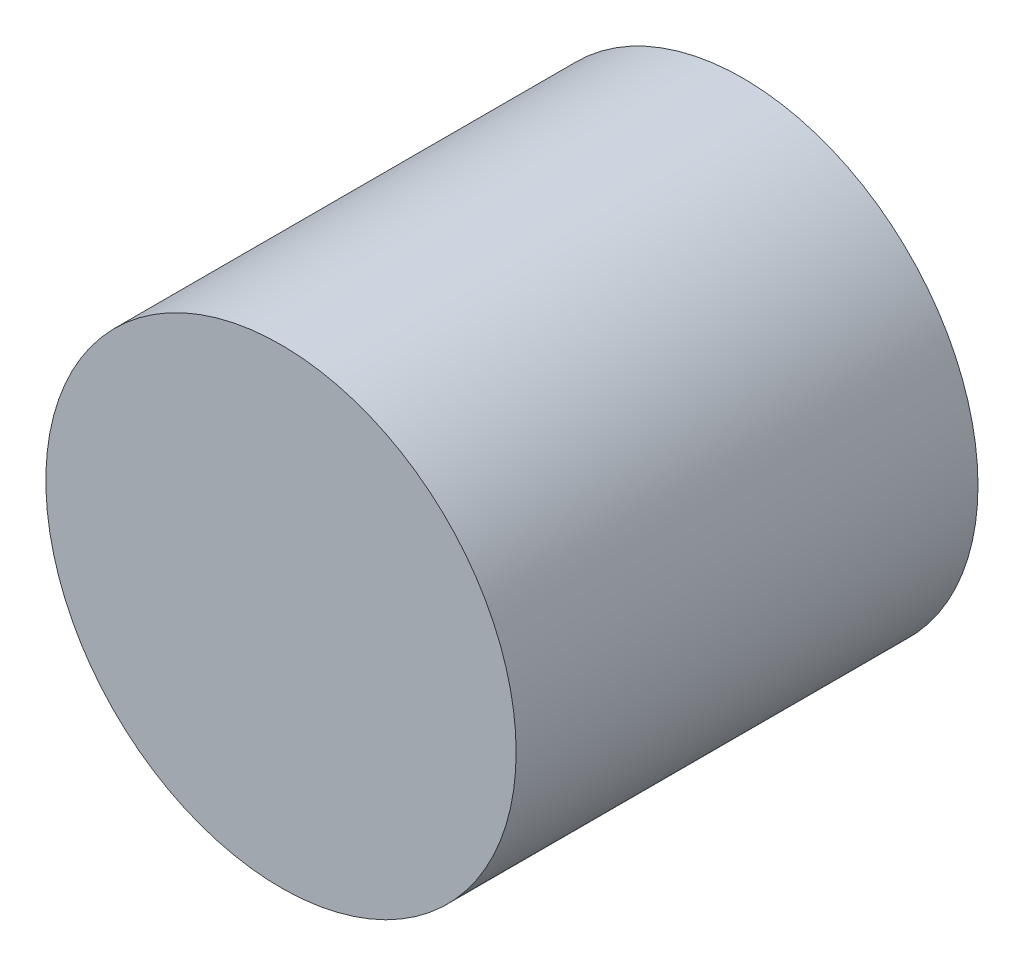
ISO-10303-21;
HEADER;
FILE_DESCRIPTION(('STEP AP214'),'2;1');
FILE_NAME('part.step','',(''),(''),'','','');
FILE_SCHEMA(('AUTOMOTIVE_DESIGN { 1 0 10303 214 1 1 1 1 }'));
ENDSEC;
DATA;
#1=APPLICATION_CONTEXT('core data for automotive mechanical design processes');
#2=APPLICATION_PROTOCOL_DEFINITION('international standard','automotive_design',2000,#1);
#3=PRODUCT_CONTEXT('',#1,'mechanical');
#4=PRODUCT('Part','Part','',(#3));
#5=PRODUCT_RELATED_PRODUCT_CATEGORY('part','',(#4));
#6=PRODUCT_DEFINITION_FORMATION('','',#4);
#7=PRODUCT_DEFINITION_CONTEXT('part definition',#1,'design');
#8=PRODUCT_DEFINITION('design','',#6,#7);
#9=PRODUCT_DEFINITION_SHAPE('','',#8);
#10=(LENGTH_UNIT() NAMED_UNIT(*) SI_UNIT(.MILLI.,.METRE.));
#11=(NAMED_UNIT(*) PLANE_ANGLE_UNIT() SI_UNIT($,.RADIAN.));
#12=(NAMED_UNIT(*) SI_UNIT($,.STERADIAN.) SOLID_ANGLE_UNIT());
#13=UNCERTAINTY_MEASURE_WITH_UNIT(LENGTH_MEASURE(1.E-05),#10,'distance_accuracy_value','');
#14=(GEOMETRIC_REPRESENTATION_CONTEXT(3) GLOBAL_UNCERTAINTY_ASSIGNED_CONTEXT((#13)) GLOBAL_UNIT_ASSIGNED_CONTEXT((#10,
#11,#12)) REPRESENTATION_CONTEXT('',''));
#15=CARTESIAN_POINT('',(0.,0.,0.));
#16=DIRECTION('',(0.,0.,1.));
#17=DIRECTION('',(1.,0.,0.));
#18=AXIS2_PLACEMENT_3D('',#15,#16,#17);
#19=CARTESIAN_POINT('',(0.,0.,-10.));
#20=DIRECTION('',(0.,0.,1.));
#21=DIRECTION('',(1.,0.,0.));
#22=AXIS2_PLACEMENT_3D('',#19,#20,#21);
#23=CYLINDRICAL_SURFACE('',#22,5.0915);
#24=CARTESIAN_POINT('',(0.,0.,-10.));
#25=DIRECTION('',(0.,0.,1.));
#26=DIRECTION('',(1.,0.,0.));
#27=AXIS2_PLACEMENT_3D('',#24,#25,#26);
#28=CIRCLE('',#27,5.0915);
#29=CARTESIAN_POINT('',(5.0915,0.,-10.));
#30=VERTEX_POINT('',#29);
#31=EDGE_CURVE('E10',#30,#30,#28,.T.);
#32=ORIENTED_EDGE('',*,*,#31,.T.);
#33=EDGE_LOOP('',(#32));
#34=FACE_BOUND('',#33,.T.);
#35=CARTESIAN_POINT('',(0.,0.,0.));
#36=DIRECTION('',(0.,0.,1.));
#37=DIRECTION('',(1.,0.,0.));
#38=AXIS2_PLACEMENT_3D('',#35,#36,#37);
#39=CIRCLE('',#38,5.0915);
#40=CARTESIAN_POINT('',(5.0915,0.,0.));
#41=VERTEX_POINT('',#40);
#42=EDGE_CURVE('E35',#41,#41,#39,.T.);
#43=ORIENTED_EDGE('',*,*,#42,.F.);
#44=EDGE_LOOP('',(#43));
#45=FACE_BOUND('',#44,.T.);
#46=ADVANCED_FACE('F29',(#34,#45),#23,.T.);
#47=CARTESIAN_POINT('',(0.,0.,-10.));
#48=DIRECTION('',(0.,0.,1.));
#49=DIRECTION('',(1.,0.,0.));
#50=AXIS2_PLACEMENT_3D('',#47,#48,#49);
#51=PLANE('',#50);
#52=ORIENTED_EDGE('',*,*,#31,.F.);
#53=EDGE_LOOP('',(#52));
#54=FACE_BOUND('',#53,.T.);
#55=ADVANCED_FACE('F44',(#54),#51,.F.);
#56=CARTESIAN_POINT('',(0.,0.,0.));
#57=DIRECTION('',(0.,0.,1.));
#58=DIRECTION('',(1.,0.,0.));
#59=AXIS2_PLACEMENT_3D('',#56,#57,#58);
#60=PLANE('',#59);
#61=ORIENTED_EDGE('',*,*,#42,.T.);
#62=EDGE_LOOP('',(#61));
#63=FACE_BOUND('',#62,.T.);
#64=ADVANCED_FACE('F41',(#63),#60,.T.);
#65=CLOSED_SHELL('',(#46,#55,#64));
#66=MANIFOLD_SOLID_BREP('B2',#65);
#67=ADVANCED_BREP_SHAPE_REPRESENTATION('',(#18,#66),#14);
#68=SHAPE_DEFINITION_REPRESENTATION(#9,#67);
ENDSEC;
END-ISO-10303-21;
